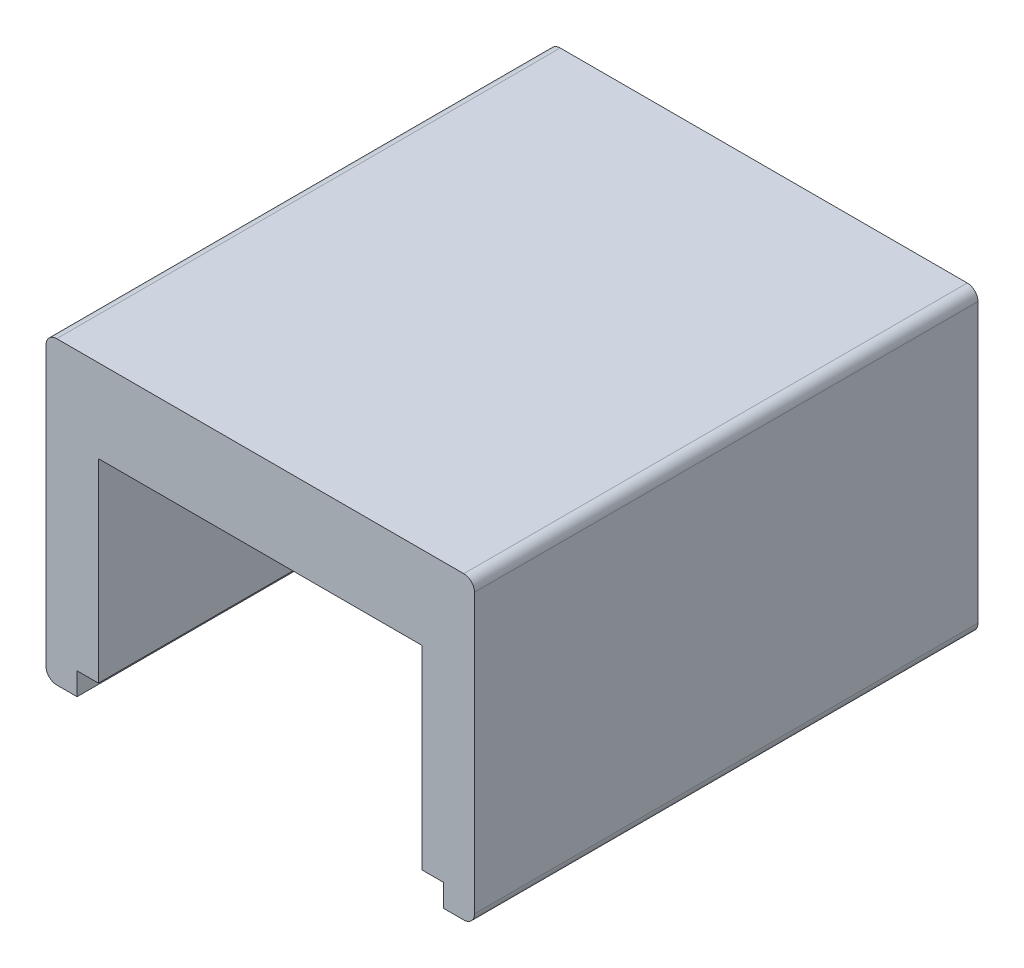
ISO-10303-21;
HEADER;
FILE_DESCRIPTION(('STEP AP214'),'2;1');
FILE_NAME('part.step','',(''),(''),'','','');
FILE_SCHEMA(('AUTOMOTIVE_DESIGN { 1 0 10303 214 1 1 1 1 }'));
ENDSEC;
DATA;
#1=APPLICATION_CONTEXT('core data for automotive mechanical design processes');
#2=APPLICATION_PROTOCOL_DEFINITION('international standard','automotive_design',2000,#1);
#3=PRODUCT_CONTEXT('',#1,'mechanical');
#4=PRODUCT('Part','Part','',(#3));
#5=PRODUCT_RELATED_PRODUCT_CATEGORY('part','',(#4));
#6=PRODUCT_DEFINITION_FORMATION('','',#4);
#7=PRODUCT_DEFINITION_CONTEXT('part definition',#1,'design');
#8=PRODUCT_DEFINITION('design','',#6,#7);
#9=PRODUCT_DEFINITION_SHAPE('','',#8);
#10=(LENGTH_UNIT() NAMED_UNIT(*) SI_UNIT(.MILLI.,.METRE.));
#11=(NAMED_UNIT(*) PLANE_ANGLE_UNIT() SI_UNIT($,.RADIAN.));
#12=(NAMED_UNIT(*) SI_UNIT($,.STERADIAN.) SOLID_ANGLE_UNIT());
#13=UNCERTAINTY_MEASURE_WITH_UNIT(LENGTH_MEASURE(1.E-05),#10,'distance_accuracy_value','');
#14=(GEOMETRIC_REPRESENTATION_CONTEXT(3) GLOBAL_UNCERTAINTY_ASSIGNED_CONTEXT((#13)) GLOBAL_UNIT_ASSIGNED_CONTEXT((#10,
#11,#12)) REPRESENTATION_CONTEXT('',''));
#15=CARTESIAN_POINT('',(0.,0.,0.));
#16=DIRECTION('',(0.,0.,1.));
#17=DIRECTION('',(1.,0.,0.));
#18=AXIS2_PLACEMENT_3D('',#15,#16,#17);
#19=CARTESIAN_POINT('',(0.,0.,94.));
#20=DIRECTION('',(0.,1.,0.));
#21=DIRECTION('',(0.,0.,1.));
#22=AXIS2_PLACEMENT_3D('',#19,#20,#21);
#23=PLANE('',#22);
#24=DIRECTION('',(1.,0.,0.));
#25=VECTOR('',#24,1.);
#26=CARTESIAN_POINT('',(0.,0.,0.));
#27=LINE('',#26,#25);
#28=CARTESIAN_POINT('',(74.2,0.,0.));
#29=VERTEX_POINT('',#28);
#30=CARTESIAN_POINT('',(78.,0.,0.));
#31=VERTEX_POINT('',#30);
#32=EDGE_CURVE('E234',#29,#31,#27,.T.);
#33=ORIENTED_EDGE('',*,*,#32,.T.);
#34=DIRECTION('',(0.,0.,-1.));
#35=VECTOR('',#34,1.);
#36=CARTESIAN_POINT('',(78.,0.,94.));
#37=LINE('',#36,#35);
#38=CARTESIAN_POINT('',(78.,0.,94.));
#39=VERTEX_POINT('',#38);
#40=EDGE_CURVE('E254',#31,#39,#37,.F.);
#41=ORIENTED_EDGE('',*,*,#40,.T.);
#42=DIRECTION('',(1.,0.,0.));
#43=VECTOR('',#42,1.);
#44=CARTESIAN_POINT('',(0.,0.,94.));
#45=LINE('',#44,#43);
#46=CARTESIAN_POINT('',(74.2,0.,94.));
#47=VERTEX_POINT('',#46);
#48=EDGE_CURVE('E222',#47,#39,#45,.T.);
#49=ORIENTED_EDGE('',*,*,#48,.F.);
#50=DIRECTION('',(0.,0.,1.));
#51=VECTOR('',#50,1.);
#52=CARTESIAN_POINT('',(74.2,0.,0.));
#53=LINE('',#52,#51);
#54=EDGE_CURVE('E201',#29,#47,#53,.T.);
#55=ORIENTED_EDGE('',*,*,#54,.F.);
#56=EDGE_LOOP('',(#33,#41,#49,#55));
#57=FACE_BOUND('',#56,.T.);
#58=ADVANCED_FACE('F35',(#57),#23,.F.);
#59=CARTESIAN_POINT('',(0.,0.,94.));
#60=DIRECTION('',(0.,0.,-1.));
#61=DIRECTION('',(-1.,0.,0.));
#62=AXIS2_PLACEMENT_3D('',#59,#60,#61);
#63=PLANE('',#62);
#64=ORIENTED_EDGE('',*,*,#48,.T.);
#65=CARTESIAN_POINT('',(78.,2.,94.));
#66=DIRECTION('',(0.,0.,-1.));
#67=DIRECTION('',(-1.,0.,0.));
#68=AXIS2_PLACEMENT_3D('',#65,#66,#67);
#69=CIRCLE('',#68,2.);
#70=CARTESIAN_POINT('',(80.,2.,94.));
#71=VERTEX_POINT('',#70);
#72=EDGE_CURVE('E261',#39,#71,#69,.F.);
#73=ORIENTED_EDGE('',*,*,#72,.T.);
#74=DIRECTION('',(0.,1.,0.));
#75=VECTOR('',#74,1.);
#76=CARTESIAN_POINT('',(80.,0.,94.));
#77=LINE('',#76,#75);
#78=CARTESIAN_POINT('',(80.,54.,94.));
#79=VERTEX_POINT('',#78);
#80=EDGE_CURVE('E226',#71,#79,#77,.T.);
#81=ORIENTED_EDGE('',*,*,#80,.T.);
#82=CARTESIAN_POINT('',(78.,54.,94.));
#83=DIRECTION('',(0.,0.,-1.));
#84=DIRECTION('',(-1.,0.,0.));
#85=AXIS2_PLACEMENT_3D('',#82,#83,#84);
#86=CIRCLE('',#85,2.);
#87=CARTESIAN_POINT('',(78.,56.,94.));
#88=VERTEX_POINT('',#87);
#89=EDGE_CURVE('E259',#79,#88,#86,.F.);
#90=ORIENTED_EDGE('',*,*,#89,.T.);
#91=DIRECTION('',(-1.,0.,0.));
#92=VECTOR('',#91,1.);
#93=CARTESIAN_POINT('',(0.,56.,94.));
#94=LINE('',#93,#92);
#95=CARTESIAN_POINT('',(2.,56.,94.));
#96=VERTEX_POINT('',#95);
#97=EDGE_CURVE('E229',#88,#96,#94,.T.);
#98=ORIENTED_EDGE('',*,*,#97,.T.);
#99=CARTESIAN_POINT('',(2.,54.,94.));
#100=DIRECTION('',(0.,0.,-1.));
#101=DIRECTION('',(-1.,0.,0.));
#102=AXIS2_PLACEMENT_3D('',#99,#100,#101);
#103=CIRCLE('',#102,2.);
#104=CARTESIAN_POINT('',(0.,54.,94.));
#105=VERTEX_POINT('',#104);
#106=EDGE_CURVE('E256',#96,#105,#103,.F.);
#107=ORIENTED_EDGE('',*,*,#106,.T.);
#108=DIRECTION('',(0.,-1.,0.));
#109=VECTOR('',#108,1.);
#110=CARTESIAN_POINT('',(0.,0.,94.));
#111=LINE('',#110,#109);
#112=CARTESIAN_POINT('',(0.,2.,94.));
#113=VERTEX_POINT('',#112);
#114=EDGE_CURVE('E220',#105,#113,#111,.T.);
#115=ORIENTED_EDGE('',*,*,#114,.T.);
#116=CARTESIAN_POINT('',(2.,2.,94.));
#117=DIRECTION('',(0.,0.,-1.));
#118=DIRECTION('',(-1.,0.,0.));
#119=AXIS2_PLACEMENT_3D('',#116,#117,#118);
#120=CIRCLE('',#119,2.);
#121=CARTESIAN_POINT('',(2.,0.,94.));
#122=VERTEX_POINT('',#121);
#123=EDGE_CURVE('E50',#113,#122,#120,.F.);
#124=ORIENTED_EDGE('',*,*,#123,.T.);
#125=CARTESIAN_POINT('',(5.79999999999998,0.,94.));
#126=VERTEX_POINT('',#125);
#127=EDGE_CURVE('E224',#122,#126,#45,.T.);
#128=ORIENTED_EDGE('',*,*,#127,.T.);
#129=DIRECTION('',(0.,-1.,0.));
#130=VECTOR('',#129,1.);
#131=CARTESIAN_POINT('',(5.79999999999998,0.,94.));
#132=LINE('',#131,#130);
#133=CARTESIAN_POINT('',(5.79999999999998,4.2,94.));
#134=VERTEX_POINT('',#133);
#135=EDGE_CURVE('E192',#134,#126,#132,.T.);
#136=ORIENTED_EDGE('',*,*,#135,.F.);
#137=DIRECTION('',(-1.,0.,0.));
#138=VECTOR('',#137,1.);
#139=CARTESIAN_POINT('',(9.79999999999998,4.2,94.));
#140=LINE('',#139,#138);
#141=CARTESIAN_POINT('',(9.79999999999998,4.2,94.));
#142=VERTEX_POINT('',#141);
#143=EDGE_CURVE('E190',#142,#134,#140,.T.);
#144=ORIENTED_EDGE('',*,*,#143,.F.);
#145=DIRECTION('',(0.,-1.,0.));
#146=VECTOR('',#145,1.);
#147=CARTESIAN_POINT('',(9.8,40.5,94.));
#148=LINE('',#147,#146);
#149=CARTESIAN_POINT('',(9.8,40.5,94.));
#150=VERTEX_POINT('',#149);
#151=EDGE_CURVE('E168',#150,#142,#148,.T.);
#152=ORIENTED_EDGE('',*,*,#151,.F.);
#153=DIRECTION('',(-1.,0.,0.));
#154=VECTOR('',#153,1.);
#155=CARTESIAN_POINT('',(9.8,40.5,94.));
#156=LINE('',#155,#154);
#157=CARTESIAN_POINT('',(70.2,40.5,94.));
#158=VERTEX_POINT('',#157);
#159=EDGE_CURVE('E211',#158,#150,#156,.T.);
#160=ORIENTED_EDGE('',*,*,#159,.F.);
#161=DIRECTION('',(0.,1.,0.));
#162=VECTOR('',#161,1.);
#163=CARTESIAN_POINT('',(70.2,40.5,94.));
#164=LINE('',#163,#162);
#165=CARTESIAN_POINT('',(70.2,4.2,94.));
#166=VERTEX_POINT('',#165);
#167=EDGE_CURVE('E208',#166,#158,#164,.T.);
#168=ORIENTED_EDGE('',*,*,#167,.F.);
#169=DIRECTION('',(-1.,0.,0.));
#170=VECTOR('',#169,1.);
#171=CARTESIAN_POINT('',(70.2,4.2,94.));
#172=LINE('',#171,#170);
#173=CARTESIAN_POINT('',(74.2,4.2,94.));
#174=VERTEX_POINT('',#173);
#175=EDGE_CURVE('E178',#174,#166,#172,.T.);
#176=ORIENTED_EDGE('',*,*,#175,.F.);
#177=DIRECTION('',(0.,1.,0.));
#178=VECTOR('',#177,1.);
#179=CARTESIAN_POINT('',(74.2,0.,94.));
#180=LINE('',#179,#178);
#181=EDGE_CURVE('E183',#47,#174,#180,.T.);
#182=ORIENTED_EDGE('',*,*,#181,.F.);
#183=EDGE_LOOP('',(#64,#73,#81,#90,#98,#107,#115,#124,#128,#136,#144,#152,#160,#168,#176,#182));
#184=FACE_BOUND('',#183,.T.);
#185=ADVANCED_FACE('F286',(#184),#63,.F.);
#186=CARTESIAN_POINT('',(0.,0.,0.));
#187=DIRECTION('',(0.,0.,-1.));
#188=DIRECTION('',(-1.,0.,0.));
#189=AXIS2_PLACEMENT_3D('',#186,#187,#188);
#190=PLANE('',#189);
#191=DIRECTION('',(0.,1.,0.));
#192=VECTOR('',#191,1.);
#193=CARTESIAN_POINT('',(80.,0.,0.));
#194=LINE('',#193,#192);
#195=CARTESIAN_POINT('',(80.,2.,0.));
#196=VERTEX_POINT('',#195);
#197=CARTESIAN_POINT('',(80.,54.,0.));
#198=VERTEX_POINT('',#197);
#199=EDGE_CURVE('E237',#196,#198,#194,.T.);
#200=ORIENTED_EDGE('',*,*,#199,.F.);
#201=CARTESIAN_POINT('',(78.,2.,0.));
#202=DIRECTION('',(0.,0.,-1.));
#203=DIRECTION('',(-1.,0.,0.));
#204=AXIS2_PLACEMENT_3D('',#201,#202,#203);
#205=CIRCLE('',#204,2.);
#206=EDGE_CURVE('E252',#196,#31,#205,.T.);
#207=ORIENTED_EDGE('',*,*,#206,.T.);
#208=ORIENTED_EDGE('',*,*,#32,.F.);
#209=DIRECTION('',(0.,1.,0.));
#210=VECTOR('',#209,1.);
#211=CARTESIAN_POINT('',(74.2,0.,0.));
#212=LINE('',#211,#210);
#213=CARTESIAN_POINT('',(74.2,4.2,0.));
#214=VERTEX_POINT('',#213);
#215=EDGE_CURVE('E180',#29,#214,#212,.T.);
#216=ORIENTED_EDGE('',*,*,#215,.T.);
#217=DIRECTION('',(-1.,0.,0.));
#218=VECTOR('',#217,1.);
#219=CARTESIAN_POINT('',(70.2,4.2,0.));
#220=LINE('',#219,#218);
#221=CARTESIAN_POINT('',(70.2,4.2,0.));
#222=VERTEX_POINT('',#221);
#223=EDGE_CURVE('E173',#214,#222,#220,.T.);
#224=ORIENTED_EDGE('',*,*,#223,.T.);
#225=DIRECTION('',(0.,1.,0.));
#226=VECTOR('',#225,1.);
#227=CARTESIAN_POINT('',(70.2,40.5,0.));
#228=LINE('',#227,#226);
#229=CARTESIAN_POINT('',(70.2,40.5,0.));
#230=VERTEX_POINT('',#229);
#231=EDGE_CURVE('E161',#222,#230,#228,.T.);
#232=ORIENTED_EDGE('',*,*,#231,.T.);
#233=DIRECTION('',(-1.,0.,0.));
#234=VECTOR('',#233,1.);
#235=CARTESIAN_POINT('',(9.8,40.5,0.));
#236=LINE('',#235,#234);
#237=CARTESIAN_POINT('',(9.8,40.5,0.));
#238=VERTEX_POINT('',#237);
#239=EDGE_CURVE('E157',#230,#238,#236,.T.);
#240=ORIENTED_EDGE('',*,*,#239,.T.);
#241=DIRECTION('',(0.,-1.,0.));
#242=VECTOR('',#241,1.);
#243=CARTESIAN_POINT('',(9.8,40.5,0.));
#244=LINE('',#243,#242);
#245=CARTESIAN_POINT('',(9.79999999999998,4.2,0.));
#246=VERTEX_POINT('',#245);
#247=EDGE_CURVE('E148',#238,#246,#244,.T.);
#248=ORIENTED_EDGE('',*,*,#247,.T.);
#249=DIRECTION('',(-1.,0.,0.));
#250=VECTOR('',#249,1.);
#251=CARTESIAN_POINT('',(9.79999999999998,4.2,0.));
#252=LINE('',#251,#250);
#253=CARTESIAN_POINT('',(5.79999999999998,4.2,0.));
#254=VERTEX_POINT('',#253);
#255=EDGE_CURVE('E154',#246,#254,#252,.T.);
#256=ORIENTED_EDGE('',*,*,#255,.T.);
#257=DIRECTION('',(0.,-1.,0.));
#258=VECTOR('',#257,1.);
#259=CARTESIAN_POINT('',(5.79999999999998,0.,0.));
#260=LINE('',#259,#258);
#261=CARTESIAN_POINT('',(5.79999999999998,0.,0.));
#262=VERTEX_POINT('',#261);
#263=EDGE_CURVE('E177',#254,#262,#260,.T.);
#264=ORIENTED_EDGE('',*,*,#263,.T.);
#265=CARTESIAN_POINT('',(2.,0.,0.));
#266=VERTEX_POINT('',#265);
#267=EDGE_CURVE('E235',#266,#262,#27,.T.);
#268=ORIENTED_EDGE('',*,*,#267,.F.);
#269=CARTESIAN_POINT('',(2.,2.,0.));
#270=DIRECTION('',(0.,0.,-1.));
#271=DIRECTION('',(-1.,0.,0.));
#272=AXIS2_PLACEMENT_3D('',#269,#270,#271);
#273=CIRCLE('',#272,2.);
#274=CARTESIAN_POINT('',(0.,2.,0.));
#275=VERTEX_POINT('',#274);
#276=EDGE_CURVE('E248',#266,#275,#273,.T.);
#277=ORIENTED_EDGE('',*,*,#276,.T.);
#278=DIRECTION('',(0.,-1.,0.));
#279=VECTOR('',#278,1.);
#280=CARTESIAN_POINT('',(0.,0.,0.));
#281=LINE('',#280,#279);
#282=CARTESIAN_POINT('',(0.,54.,0.));
#283=VERTEX_POINT('',#282);
#284=EDGE_CURVE('E219',#283,#275,#281,.T.);
#285=ORIENTED_EDGE('',*,*,#284,.F.);
#286=CARTESIAN_POINT('',(2.,54.,0.));
#287=DIRECTION('',(0.,0.,-1.));
#288=DIRECTION('',(-1.,0.,0.));
#289=AXIS2_PLACEMENT_3D('',#286,#287,#288);
#290=CIRCLE('',#289,2.);
#291=CARTESIAN_POINT('',(2.,56.,0.));
#292=VERTEX_POINT('',#291);
#293=EDGE_CURVE('E246',#283,#292,#290,.T.);
#294=ORIENTED_EDGE('',*,*,#293,.T.);
#295=DIRECTION('',(-1.,0.,0.));
#296=VECTOR('',#295,1.);
#297=CARTESIAN_POINT('',(0.,56.,0.));
#298=LINE('',#297,#296);
#299=CARTESIAN_POINT('',(78.,56.,0.));
#300=VERTEX_POINT('',#299);
#301=EDGE_CURVE('E223',#300,#292,#298,.T.);
#302=ORIENTED_EDGE('',*,*,#301,.F.);
#303=CARTESIAN_POINT('',(78.,54.,0.));
#304=DIRECTION('',(0.,0.,-1.));
#305=DIRECTION('',(-1.,0.,0.));
#306=AXIS2_PLACEMENT_3D('',#303,#304,#305);
#307=CIRCLE('',#306,2.);
#308=EDGE_CURVE('E250',#300,#198,#307,.T.);
#309=ORIENTED_EDGE('',*,*,#308,.T.);
#310=EDGE_LOOP('',(#200,#207,#208,#216,#224,#232,#240,#248,#256,#264,#268,#277,#285,#294,#302,#309));
#311=FACE_BOUND('',#310,.T.);
#312=ADVANCED_FACE('F151',(#311),#190,.T.);
#313=CARTESIAN_POINT('',(0.,0.,94.));
#314=DIRECTION('',(1.,0.,0.));
#315=DIRECTION('',(0.,1.,0.));
#316=AXIS2_PLACEMENT_3D('',#313,#314,#315);
#317=PLANE('',#316);
#318=ORIENTED_EDGE('',*,*,#284,.T.);
#319=DIRECTION('',(0.,0.,-1.));
#320=VECTOR('',#319,1.);
#321=CARTESIAN_POINT('',(0.,2.,94.));
#322=LINE('',#321,#320);
#323=EDGE_CURVE('E11',#275,#113,#322,.F.);
#324=ORIENTED_EDGE('',*,*,#323,.T.);
#325=ORIENTED_EDGE('',*,*,#114,.F.);
#326=DIRECTION('',(0.,0.,-1.));
#327=VECTOR('',#326,1.);
#328=CARTESIAN_POINT('',(0.,54.,94.));
#329=LINE('',#328,#327);
#330=EDGE_CURVE('E43',#105,#283,#329,.T.);
#331=ORIENTED_EDGE('',*,*,#330,.T.);
#332=EDGE_LOOP('',(#318,#324,#325,#331));
#333=FACE_BOUND('',#332,.T.);
#334=ADVANCED_FACE('F273',(#333),#317,.F.);
#335=ORIENTED_EDGE('',*,*,#127,.F.);
#336=DIRECTION('',(0.,0.,-1.));
#337=VECTOR('',#336,1.);
#338=CARTESIAN_POINT('',(2.,0.,94.));
#339=LINE('',#338,#337);
#340=EDGE_CURVE('E268',#122,#266,#339,.T.);
#341=ORIENTED_EDGE('',*,*,#340,.T.);
#342=ORIENTED_EDGE('',*,*,#267,.T.);
#343=DIRECTION('',(0.,0.,1.));
#344=VECTOR('',#343,1.);
#345=CARTESIAN_POINT('',(5.79999999999998,0.,0.));
#346=LINE('',#345,#344);
#347=EDGE_CURVE('E203',#262,#126,#346,.T.);
#348=ORIENTED_EDGE('',*,*,#347,.T.);
#349=EDGE_LOOP('',(#335,#341,#342,#348));
#350=FACE_BOUND('',#349,.T.);
#351=ADVANCED_FACE('F282',(#350),#23,.F.);
#352=CARTESIAN_POINT('',(80.,0.,94.));
#353=DIRECTION('',(-1.,0.,0.));
#354=DIRECTION('',(0.,-1.,0.));
#355=AXIS2_PLACEMENT_3D('',#352,#353,#354);
#356=PLANE('',#355);
#357=ORIENTED_EDGE('',*,*,#80,.F.);
#358=DIRECTION('',(0.,0.,-1.));
#359=VECTOR('',#358,1.);
#360=CARTESIAN_POINT('',(80.,2.,94.));
#361=LINE('',#360,#359);
#362=EDGE_CURVE('E243',#71,#196,#361,.T.);
#363=ORIENTED_EDGE('',*,*,#362,.T.);
#364=ORIENTED_EDGE('',*,*,#199,.T.);
#365=DIRECTION('',(0.,0.,-1.));
#366=VECTOR('',#365,1.);
#367=CARTESIAN_POINT('',(80.,54.,94.));
#368=LINE('',#367,#366);
#369=EDGE_CURVE('E232',#198,#79,#368,.F.);
#370=ORIENTED_EDGE('',*,*,#369,.T.);
#371=EDGE_LOOP('',(#357,#363,#364,#370));
#372=FACE_BOUND('',#371,.T.);
#373=ADVANCED_FACE('F314',(#372),#356,.F.);
#374=CARTESIAN_POINT('',(0.,56.,94.));
#375=DIRECTION('',(0.,-1.,0.));
#376=DIRECTION('',(0.,0.,-1.));
#377=AXIS2_PLACEMENT_3D('',#374,#375,#376);
#378=PLANE('',#377);
#379=ORIENTED_EDGE('',*,*,#97,.F.);
#380=DIRECTION('',(0.,0.,-1.));
#381=VECTOR('',#380,1.);
#382=CARTESIAN_POINT('',(78.,56.,94.));
#383=LINE('',#382,#381);
#384=EDGE_CURVE('E265',#88,#300,#383,.T.);
#385=ORIENTED_EDGE('',*,*,#384,.T.);
#386=ORIENTED_EDGE('',*,*,#301,.T.);
#387=DIRECTION('',(0.,0.,-1.));
#388=VECTOR('',#387,1.);
#389=CARTESIAN_POINT('',(2.,56.,94.));
#390=LINE('',#389,#388);
#391=EDGE_CURVE('E263',#292,#96,#390,.F.);
#392=ORIENTED_EDGE('',*,*,#391,.T.);
#393=EDGE_LOOP('',(#379,#385,#386,#392));
#394=FACE_BOUND('',#393,.T.);
#395=ADVANCED_FACE('F321',(#394),#378,.F.);
#396=CARTESIAN_POINT('',(9.8,40.5,94.));
#397=DIRECTION('',(1.,0.,0.));
#398=DIRECTION('',(0.,1.,0.));
#399=AXIS2_PLACEMENT_3D('',#396,#397,#398);
#400=PLANE('',#399);
#401=ORIENTED_EDGE('',*,*,#247,.F.);
#402=DIRECTION('',(0.,0.,-1.));
#403=VECTOR('',#402,1.);
#404=CARTESIAN_POINT('',(9.8,40.5,94.));
#405=LINE('',#404,#403);
#406=EDGE_CURVE('E212',#150,#238,#405,.T.);
#407=ORIENTED_EDGE('',*,*,#406,.F.);
#408=ORIENTED_EDGE('',*,*,#151,.T.);
#409=DIRECTION('',(0.,0.,1.));
#410=VECTOR('',#409,1.);
#411=CARTESIAN_POINT('',(9.79999999999998,4.2,0.));
#412=LINE('',#411,#410);
#413=EDGE_CURVE('E165',#246,#142,#412,.T.);
#414=ORIENTED_EDGE('',*,*,#413,.F.);
#415=EDGE_LOOP('',(#401,#407,#408,#414));
#416=FACE_BOUND('',#415,.T.);
#417=ADVANCED_FACE('F166',(#416),#400,.T.);
#418=CARTESIAN_POINT('',(70.2,40.5,94.));
#419=DIRECTION('',(-1.,0.,0.));
#420=DIRECTION('',(0.,0.,1.));
#421=AXIS2_PLACEMENT_3D('',#418,#419,#420);
#422=PLANE('',#421);
#423=ORIENTED_EDGE('',*,*,#231,.F.);
#424=DIRECTION('',(0.,0.,1.));
#425=VECTOR('',#424,1.);
#426=CARTESIAN_POINT('',(70.2,4.2,0.));
#427=LINE('',#426,#425);
#428=EDGE_CURVE('E162',#222,#166,#427,.T.);
#429=ORIENTED_EDGE('',*,*,#428,.T.);
#430=ORIENTED_EDGE('',*,*,#167,.T.);
#431=DIRECTION('',(0.,0.,-1.));
#432=VECTOR('',#431,1.);
#433=CARTESIAN_POINT('',(70.2,40.5,94.));
#434=LINE('',#433,#432);
#435=EDGE_CURVE('E217',#158,#230,#434,.T.);
#436=ORIENTED_EDGE('',*,*,#435,.T.);
#437=EDGE_LOOP('',(#423,#429,#430,#436));
#438=FACE_BOUND('',#437,.T.);
#439=ADVANCED_FACE('F294',(#438),#422,.T.);
#440=CARTESIAN_POINT('',(9.8,40.5,94.));
#441=DIRECTION('',(0.,-1.,0.));
#442=DIRECTION('',(0.,0.,-1.));
#443=AXIS2_PLACEMENT_3D('',#440,#441,#442);
#444=PLANE('',#443);
#445=ORIENTED_EDGE('',*,*,#239,.F.);
#446=ORIENTED_EDGE('',*,*,#435,.F.);
#447=ORIENTED_EDGE('',*,*,#159,.T.);
#448=ORIENTED_EDGE('',*,*,#406,.T.);
#449=EDGE_LOOP('',(#445,#446,#447,#448));
#450=FACE_BOUND('',#449,.T.);
#451=ADVANCED_FACE('F292',(#450),#444,.T.);
#452=CARTESIAN_POINT('',(74.2,0.,0.));
#453=DIRECTION('',(1.,0.,0.));
#454=DIRECTION('',(0.,0.,-1.));
#455=AXIS2_PLACEMENT_3D('',#452,#453,#454);
#456=PLANE('',#455);
#457=ORIENTED_EDGE('',*,*,#181,.T.);
#458=DIRECTION('',(0.,0.,1.));
#459=VECTOR('',#458,1.);
#460=CARTESIAN_POINT('',(74.2,4.2,0.));
#461=LINE('',#460,#459);
#462=EDGE_CURVE('E199',#214,#174,#461,.T.);
#463=ORIENTED_EDGE('',*,*,#462,.F.);
#464=ORIENTED_EDGE('',*,*,#215,.F.);
#465=ORIENTED_EDGE('',*,*,#54,.T.);
#466=EDGE_LOOP('',(#457,#463,#464,#465));
#467=FACE_BOUND('',#466,.T.);
#468=ADVANCED_FACE('F391',(#467),#456,.F.);
#469=CARTESIAN_POINT('',(70.2,4.2,0.));
#470=DIRECTION('',(0.,1.,0.));
#471=DIRECTION('',(0.,0.,1.));
#472=AXIS2_PLACEMENT_3D('',#469,#470,#471);
#473=PLANE('',#472);
#474=ORIENTED_EDGE('',*,*,#175,.T.);
#475=ORIENTED_EDGE('',*,*,#428,.F.);
#476=ORIENTED_EDGE('',*,*,#223,.F.);
#477=ORIENTED_EDGE('',*,*,#462,.T.);
#478=EDGE_LOOP('',(#474,#475,#476,#477));
#479=FACE_BOUND('',#478,.T.);
#480=ADVANCED_FACE('F298',(#479),#473,.F.);
#481=CARTESIAN_POINT('',(5.79999999999998,0.,0.));
#482=DIRECTION('',(-1.,0.,0.));
#483=DIRECTION('',(0.,0.,1.));
#484=AXIS2_PLACEMENT_3D('',#481,#482,#483);
#485=PLANE('',#484);
#486=ORIENTED_EDGE('',*,*,#135,.T.);
#487=ORIENTED_EDGE('',*,*,#347,.F.);
#488=ORIENTED_EDGE('',*,*,#263,.F.);
#489=DIRECTION('',(0.,0.,1.));
#490=VECTOR('',#489,1.);
#491=CARTESIAN_POINT('',(5.79999999999998,4.2,0.));
#492=LINE('',#491,#490);
#493=EDGE_CURVE('E172',#254,#134,#492,.T.);
#494=ORIENTED_EDGE('',*,*,#493,.T.);
#495=EDGE_LOOP('',(#486,#487,#488,#494));
#496=FACE_BOUND('',#495,.T.);
#497=ADVANCED_FACE('F288',(#496),#485,.F.);
#498=CARTESIAN_POINT('',(9.79999999999998,4.2,0.));
#499=DIRECTION('',(0.,1.,0.));
#500=DIRECTION('',(0.,0.,1.));
#501=AXIS2_PLACEMENT_3D('',#498,#499,#500);
#502=PLANE('',#501);
#503=ORIENTED_EDGE('',*,*,#143,.T.);
#504=ORIENTED_EDGE('',*,*,#493,.F.);
#505=ORIENTED_EDGE('',*,*,#255,.F.);
#506=ORIENTED_EDGE('',*,*,#413,.T.);
#507=EDGE_LOOP('',(#503,#504,#505,#506));
#508=FACE_BOUND('',#507,.T.);
#509=ADVANCED_FACE('F175',(#508),#502,.F.);
#510=CARTESIAN_POINT('',(78.,2.,94.));
#511=DIRECTION('',(0.,0.,-1.));
#512=DIRECTION('',(-1.,0.,0.));
#513=AXIS2_PLACEMENT_3D('',#510,#511,#512);
#514=CYLINDRICAL_SURFACE('',#513,2.);
#515=ORIENTED_EDGE('',*,*,#72,.F.);
#516=ORIENTED_EDGE('',*,*,#40,.F.);
#517=ORIENTED_EDGE('',*,*,#206,.F.);
#518=ORIENTED_EDGE('',*,*,#362,.F.);
#519=EDGE_LOOP('',(#515,#516,#517,#518));
#520=FACE_BOUND('',#519,.T.);
#521=ADVANCED_FACE('F309',(#520),#514,.T.);
#522=CARTESIAN_POINT('',(78.,54.,94.));
#523=DIRECTION('',(0.,0.,-1.));
#524=DIRECTION('',(-1.,0.,0.));
#525=AXIS2_PLACEMENT_3D('',#522,#523,#524);
#526=CYLINDRICAL_SURFACE('',#525,2.);
#527=ORIENTED_EDGE('',*,*,#89,.F.);
#528=ORIENTED_EDGE('',*,*,#369,.F.);
#529=ORIENTED_EDGE('',*,*,#308,.F.);
#530=ORIENTED_EDGE('',*,*,#384,.F.);
#531=EDGE_LOOP('',(#527,#528,#529,#530));
#532=FACE_BOUND('',#531,.T.);
#533=ADVANCED_FACE('F317',(#532),#526,.T.);
#534=CARTESIAN_POINT('',(2.,2.,94.));
#535=DIRECTION('',(0.,0.,-1.));
#536=DIRECTION('',(-1.,0.,0.));
#537=AXIS2_PLACEMENT_3D('',#534,#535,#536);
#538=CYLINDRICAL_SURFACE('',#537,2.);
#539=ORIENTED_EDGE('',*,*,#123,.F.);
#540=ORIENTED_EDGE('',*,*,#323,.F.);
#541=ORIENTED_EDGE('',*,*,#276,.F.);
#542=ORIENTED_EDGE('',*,*,#340,.F.);
#543=EDGE_LOOP('',(#539,#540,#541,#542));
#544=FACE_BOUND('',#543,.T.);
#545=ADVANCED_FACE('F280',(#544),#538,.T.);
#546=CARTESIAN_POINT('',(2.,54.,94.));
#547=DIRECTION('',(0.,0.,-1.));
#548=DIRECTION('',(-1.,0.,0.));
#549=AXIS2_PLACEMENT_3D('',#546,#547,#548);
#550=CYLINDRICAL_SURFACE('',#549,2.);
#551=ORIENTED_EDGE('',*,*,#106,.F.);
#552=ORIENTED_EDGE('',*,*,#391,.F.);
#553=ORIENTED_EDGE('',*,*,#293,.F.);
#554=ORIENTED_EDGE('',*,*,#330,.F.);
#555=EDGE_LOOP('',(#551,#552,#553,#554));
#556=FACE_BOUND('',#555,.T.);
#557=ADVANCED_FACE('F37',(#556),#550,.T.);
#558=CLOSED_SHELL('',(#58,#185,#312,#334,#351,#373,#395,#417,#439,#451,#468,#480,#497,#509,#521,
#533,#545,#557));
#559=MANIFOLD_SOLID_BREP('B2',#558);
#560=ADVANCED_BREP_SHAPE_REPRESENTATION('',(#18,#559),#14);
#561=SHAPE_DEFINITION_REPRESENTATION(#9,#560);
ENDSEC;
END-ISO-10303-21;
